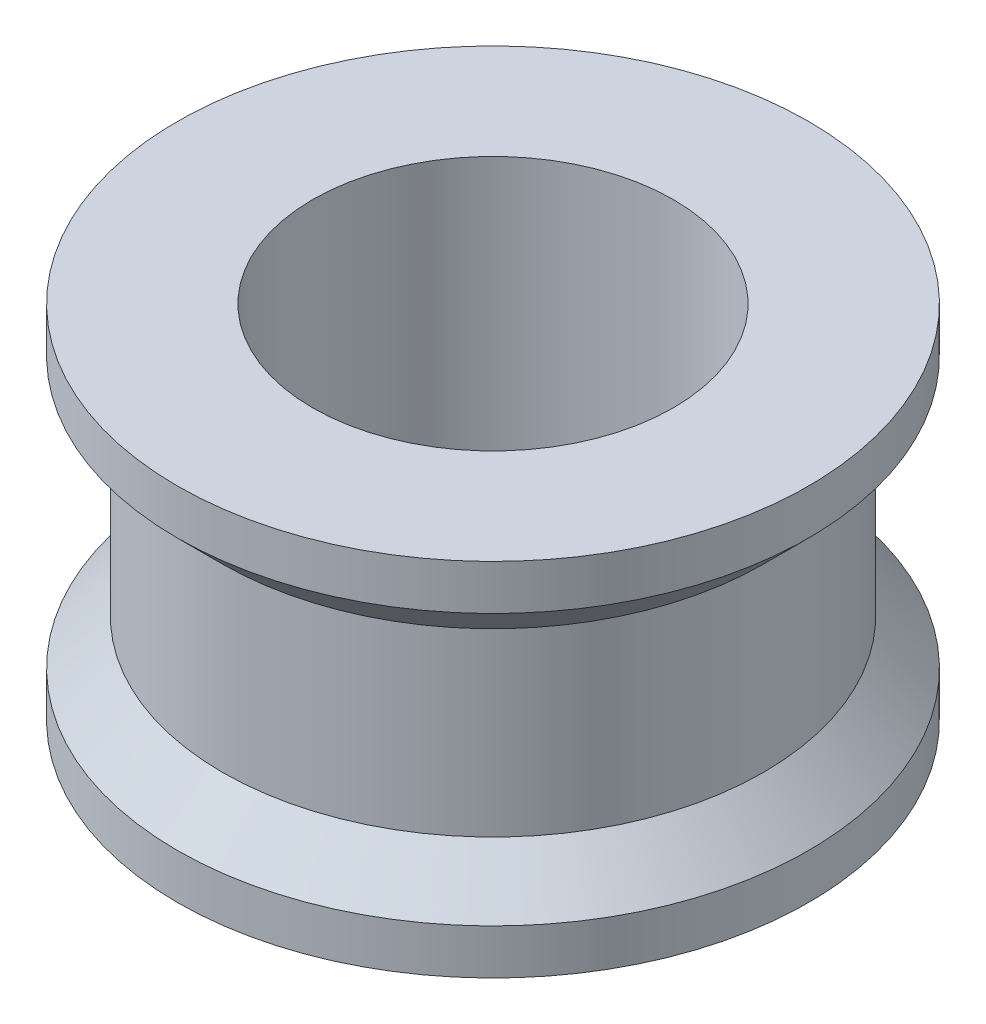
ISO-10303-21;
HEADER;
FILE_DESCRIPTION(('STEP AP214'),'2;1');
FILE_NAME('part.step','',(''),(''),'','','');
FILE_SCHEMA(('AUTOMOTIVE_DESIGN { 1 0 10303 214 1 1 1 1 }'));
ENDSEC;
DATA;
#1=APPLICATION_CONTEXT('core data for automotive mechanical design processes');
#2=APPLICATION_PROTOCOL_DEFINITION('international standard','automotive_design',2000,#1);
#3=PRODUCT_CONTEXT('',#1,'mechanical');
#4=PRODUCT('Part','Part','',(#3));
#5=PRODUCT_RELATED_PRODUCT_CATEGORY('part','',(#4));
#6=PRODUCT_DEFINITION_FORMATION('','',#4);
#7=PRODUCT_DEFINITION_CONTEXT('part definition',#1,'design');
#8=PRODUCT_DEFINITION('design','',#6,#7);
#9=PRODUCT_DEFINITION_SHAPE('','',#8);
#10=(LENGTH_UNIT() NAMED_UNIT(*) SI_UNIT(.MILLI.,.METRE.));
#11=(NAMED_UNIT(*) PLANE_ANGLE_UNIT() SI_UNIT($,.RADIAN.));
#12=(NAMED_UNIT(*) SI_UNIT($,.STERADIAN.) SOLID_ANGLE_UNIT());
#13=UNCERTAINTY_MEASURE_WITH_UNIT(LENGTH_MEASURE(1.E-05),#10,'distance_accuracy_value','');
#14=(GEOMETRIC_REPRESENTATION_CONTEXT(3) GLOBAL_UNCERTAINTY_ASSIGNED_CONTEXT((#13)) GLOBAL_UNIT_ASSIGNED_CONTEXT((#10,
#11,#12)) REPRESENTATION_CONTEXT('',''));
#15=CARTESIAN_POINT('',(0.,0.,0.));
#16=DIRECTION('',(0.,0.,1.));
#17=DIRECTION('',(1.,0.,0.));
#18=AXIS2_PLACEMENT_3D('',#15,#16,#17);
#19=CARTESIAN_POINT('',(0.,45.4910573758764,0.));
#20=DIRECTION('',(0.,1.,0.));
#21=DIRECTION('',(0.,0.,1.));
#22=AXIS2_PLACEMENT_3D('',#19,#20,#21);
#23=CYLINDRICAL_SURFACE('',#22,2.);
#24=CARTESIAN_POINT('',(0.,0.,0.));
#25=DIRECTION('',(0.,1.,0.));
#26=DIRECTION('',(0.,0.,1.));
#27=AXIS2_PLACEMENT_3D('',#24,#25,#26);
#28=CIRCLE('',#27,2.);
#29=CARTESIAN_POINT('',(0.,0.,2.));
#30=VERTEX_POINT('',#29);
#31=EDGE_CURVE('E10',#30,#30,#28,.T.);
#32=ORIENTED_EDGE('',*,*,#31,.F.);
#33=EDGE_LOOP('',(#32));
#34=FACE_BOUND('',#33,.T.);
#35=CARTESIAN_POINT('',(0.,4.,0.));
#36=DIRECTION('',(0.,1.,0.));
#37=DIRECTION('',(0.,0.,1.));
#38=AXIS2_PLACEMENT_3D('',#35,#36,#37);
#39=CIRCLE('',#38,2.00000000000001);
#40=CARTESIAN_POINT('',(0.,4.,2.00000000000001));
#41=VERTEX_POINT('',#40);
#42=EDGE_CURVE('E69',#41,#41,#39,.T.);
#43=ORIENTED_EDGE('',*,*,#42,.T.);
#44=EDGE_LOOP('',(#43));
#45=FACE_BOUND('',#44,.T.);
#46=ADVANCED_FACE('F34',(#34,#45),#23,.F.);
#47=CARTESIAN_POINT('',(2.,0.,0.));
#48=DIRECTION('',(0.,1.,0.));
#49=DIRECTION('',(0.,0.,1.));
#50=AXIS2_PLACEMENT_3D('',#47,#48,#49);
#51=PLANE('',#50);
#52=CARTESIAN_POINT('',(0.,0.,0.));
#53=DIRECTION('',(0.,1.,0.));
#54=DIRECTION('',(0.,0.,1.));
#55=AXIS2_PLACEMENT_3D('',#52,#53,#54);
#56=CIRCLE('',#55,3.5);
#57=CARTESIAN_POINT('',(0.,0.,3.5));
#58=VERTEX_POINT('',#57);
#59=EDGE_CURVE('E41',#58,#58,#56,.T.);
#60=ORIENTED_EDGE('',*,*,#59,.F.);
#61=EDGE_LOOP('',(#60));
#62=FACE_BOUND('',#61,.T.);
#63=ORIENTED_EDGE('',*,*,#31,.T.);
#64=EDGE_LOOP('',(#63));
#65=FACE_BOUND('',#64,.T.);
#66=ADVANCED_FACE('F107',(#62,#65),#51,.F.);
#67=CARTESIAN_POINT('',(0.,45.4910573758764,0.));
#68=DIRECTION('',(0.,1.,0.));
#69=DIRECTION('',(0.,0.,1.));
#70=AXIS2_PLACEMENT_3D('',#67,#68,#69);
#71=CYLINDRICAL_SURFACE('',#70,3.5);
#72=CARTESIAN_POINT('',(0.,0.5,0.));
#73=DIRECTION('',(0.,1.,0.));
#74=DIRECTION('',(0.,0.,1.));
#75=AXIS2_PLACEMENT_3D('',#72,#73,#74);
#76=CIRCLE('',#75,3.50000000000001);
#77=CARTESIAN_POINT('',(0.,0.5,3.50000000000001));
#78=VERTEX_POINT('',#77);
#79=EDGE_CURVE('E48',#78,#78,#76,.T.);
#80=ORIENTED_EDGE('',*,*,#79,.F.);
#81=EDGE_LOOP('',(#80));
#82=FACE_BOUND('',#81,.T.);
#83=ORIENTED_EDGE('',*,*,#59,.T.);
#84=EDGE_LOOP('',(#83));
#85=FACE_BOUND('',#84,.T.);
#86=ADVANCED_FACE('F102',(#82,#85),#71,.T.);
#87=CARTESIAN_POINT('',(0.,0.5,0.));
#88=DIRECTION('',(0.,-1.,0.));
#89=DIRECTION('',(0.,0.,-1.));
#90=AXIS2_PLACEMENT_3D('',#87,#88,#89);
#91=CONICAL_SURFACE('',#90,3.50000000000001,0.785398163397454);
#92=CARTESIAN_POINT('',(0.,0.999999999999994,0.));
#93=DIRECTION('',(0.,1.,0.));
#94=DIRECTION('',(0.,0.,1.));
#95=AXIS2_PLACEMENT_3D('',#92,#93,#94);
#96=CIRCLE('',#95,3.00000000000001);
#97=CARTESIAN_POINT('',(0.,0.999999999999994,3.00000000000001));
#98=VERTEX_POINT('',#97);
#99=EDGE_CURVE('E53',#98,#98,#96,.T.);
#100=ORIENTED_EDGE('',*,*,#99,.F.);
#101=EDGE_LOOP('',(#100));
#102=FACE_BOUND('',#101,.T.);
#103=ORIENTED_EDGE('',*,*,#79,.T.);
#104=EDGE_LOOP('',(#103));
#105=FACE_BOUND('',#104,.T.);
#106=ADVANCED_FACE('F96',(#102,#105),#91,.T.);
#107=CARTESIAN_POINT('',(0.,45.4910573758764,0.));
#108=DIRECTION('',(0.,1.,0.));
#109=DIRECTION('',(0.,0.,1.));
#110=AXIS2_PLACEMENT_3D('',#107,#108,#109);
#111=CYLINDRICAL_SURFACE('',#110,3.00000000000001);
#112=CARTESIAN_POINT('',(0.,3.,0.));
#113=DIRECTION('',(0.,1.,0.));
#114=DIRECTION('',(0.,0.,1.));
#115=AXIS2_PLACEMENT_3D('',#112,#113,#114);
#116=CIRCLE('',#115,3.00000000000001);
#117=CARTESIAN_POINT('',(0.,3.,3.00000000000001));
#118=VERTEX_POINT('',#117);
#119=EDGE_CURVE('E58',#118,#118,#116,.T.);
#120=ORIENTED_EDGE('',*,*,#119,.F.);
#121=EDGE_LOOP('',(#120));
#122=FACE_BOUND('',#121,.T.);
#123=ORIENTED_EDGE('',*,*,#99,.T.);
#124=EDGE_LOOP('',(#123));
#125=FACE_BOUND('',#124,.T.);
#126=ADVANCED_FACE('F90',(#122,#125),#111,.T.);
#127=CARTESIAN_POINT('',(0.,3.,0.));
#128=DIRECTION('',(0.,1.,0.));
#129=DIRECTION('',(0.,0.,1.));
#130=AXIS2_PLACEMENT_3D('',#127,#128,#129);
#131=CONICAL_SURFACE('',#130,3.00000000000001,0.785398163397447);
#132=CARTESIAN_POINT('',(0.,3.5,0.));
#133=DIRECTION('',(0.,1.,0.));
#134=DIRECTION('',(0.,0.,1.));
#135=AXIS2_PLACEMENT_3D('',#132,#133,#134);
#136=CIRCLE('',#135,3.50000000000001);
#137=CARTESIAN_POINT('',(0.,3.5,3.50000000000001));
#138=VERTEX_POINT('',#137);
#139=EDGE_CURVE('E61',#138,#138,#136,.T.);
#140=ORIENTED_EDGE('',*,*,#139,.F.);
#141=EDGE_LOOP('',(#140));
#142=FACE_BOUND('',#141,.T.);
#143=ORIENTED_EDGE('',*,*,#119,.T.);
#144=EDGE_LOOP('',(#143));
#145=FACE_BOUND('',#144,.T.);
#146=ADVANCED_FACE('F84',(#142,#145),#131,.T.);
#147=CARTESIAN_POINT('',(0.,45.4910573758764,0.));
#148=DIRECTION('',(0.,1.,0.));
#149=DIRECTION('',(0.,0.,1.));
#150=AXIS2_PLACEMENT_3D('',#147,#148,#149);
#151=CYLINDRICAL_SURFACE('',#150,3.50000000000001);
#152=CARTESIAN_POINT('',(0.,4.,0.));
#153=DIRECTION('',(0.,1.,0.));
#154=DIRECTION('',(0.,0.,1.));
#155=AXIS2_PLACEMENT_3D('',#152,#153,#154);
#156=CIRCLE('',#155,3.50000000000001);
#157=CARTESIAN_POINT('',(0.,4.,3.50000000000001));
#158=VERTEX_POINT('',#157);
#159=EDGE_CURVE('E65',#158,#158,#156,.T.);
#160=ORIENTED_EDGE('',*,*,#159,.F.);
#161=EDGE_LOOP('',(#160));
#162=FACE_BOUND('',#161,.T.);
#163=ORIENTED_EDGE('',*,*,#139,.T.);
#164=EDGE_LOOP('',(#163));
#165=FACE_BOUND('',#164,.T.);
#166=ADVANCED_FACE('F78',(#162,#165),#151,.T.);
#167=CARTESIAN_POINT('',(3.50000000000001,4.,0.));
#168=DIRECTION('',(0.,-1.,0.));
#169=DIRECTION('',(0.,0.,-1.));
#170=AXIS2_PLACEMENT_3D('',#167,#168,#169);
#171=PLANE('',#170);
#172=ORIENTED_EDGE('',*,*,#42,.F.);
#173=EDGE_LOOP('',(#172));
#174=FACE_BOUND('',#173,.T.);
#175=ORIENTED_EDGE('',*,*,#159,.T.);
#176=EDGE_LOOP('',(#175));
#177=FACE_BOUND('',#176,.T.);
#178=ADVANCED_FACE('F75',(#174,#177),#171,.F.);
#179=CLOSED_SHELL('',(#46,#66,#86,#106,#126,#146,#166,#178));
#180=MANIFOLD_SOLID_BREP('B2',#179);
#181=ADVANCED_BREP_SHAPE_REPRESENTATION('',(#18,#180),#14);
#182=SHAPE_DEFINITION_REPRESENTATION(#9,#181);
ENDSEC;
END-ISO-10303-21;
